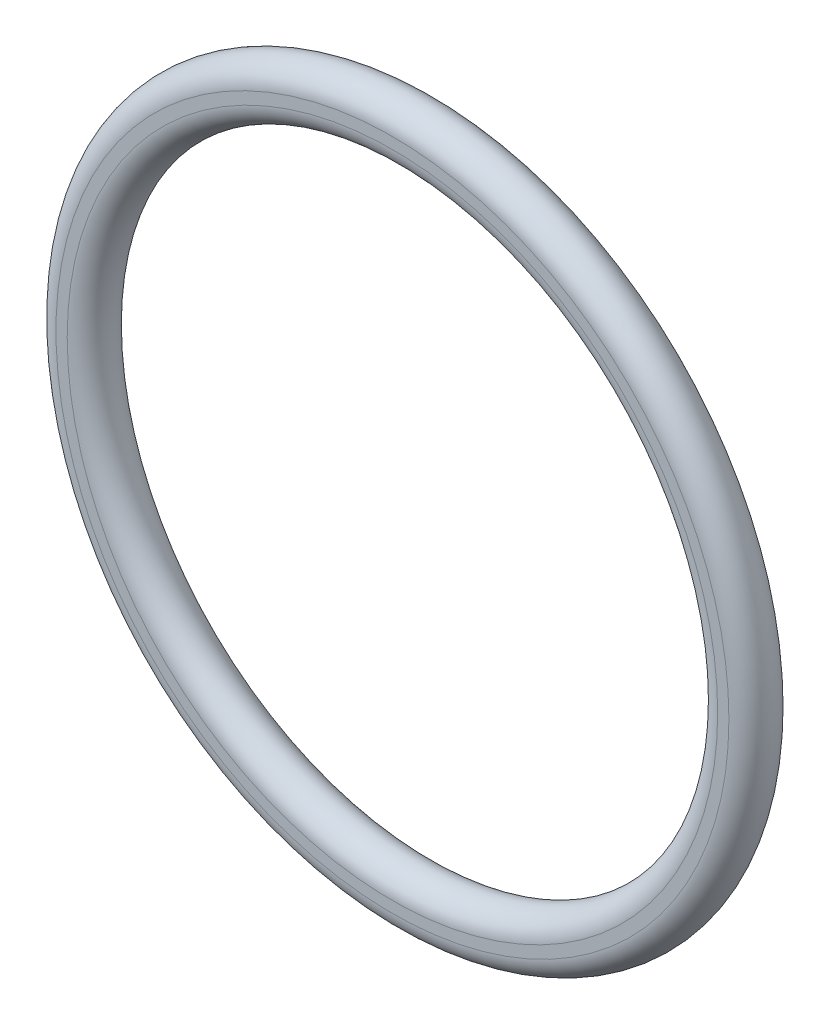
ISO-10303-21;
HEADER;
FILE_DESCRIPTION(('STEP AP214'),'2;1');
FILE_NAME('part.step','',(''),(''),'','','');
FILE_SCHEMA(('AUTOMOTIVE_DESIGN { 1 0 10303 214 1 1 1 1 }'));
ENDSEC;
DATA;
#1=APPLICATION_CONTEXT('core data for automotive mechanical design processes');
#2=APPLICATION_PROTOCOL_DEFINITION('international standard','automotive_design',2000,#1);
#3=PRODUCT_CONTEXT('',#1,'mechanical');
#4=PRODUCT('Part','Part','',(#3));
#5=PRODUCT_RELATED_PRODUCT_CATEGORY('part','',(#4));
#6=PRODUCT_DEFINITION_FORMATION('','',#4);
#7=PRODUCT_DEFINITION_CONTEXT('part definition',#1,'design');
#8=PRODUCT_DEFINITION('design','',#6,#7);
#9=PRODUCT_DEFINITION_SHAPE('','',#8);
#10=(LENGTH_UNIT() NAMED_UNIT(*) SI_UNIT(.MILLI.,.METRE.));
#11=(NAMED_UNIT(*) PLANE_ANGLE_UNIT() SI_UNIT($,.RADIAN.));
#12=(NAMED_UNIT(*) SI_UNIT($,.STERADIAN.) SOLID_ANGLE_UNIT());
#13=UNCERTAINTY_MEASURE_WITH_UNIT(LENGTH_MEASURE(1.E-05),#10,'distance_accuracy_value','');
#14=(GEOMETRIC_REPRESENTATION_CONTEXT(3) GLOBAL_UNCERTAINTY_ASSIGNED_CONTEXT((#13)) GLOBAL_UNIT_ASSIGNED_CONTEXT((#10,
#11,#12)) REPRESENTATION_CONTEXT('',''));
#15=CARTESIAN_POINT('',(0.,0.,0.));
#16=DIRECTION('',(0.,0.,1.));
#17=DIRECTION('',(1.,0.,0.));
#18=AXIS2_PLACEMENT_3D('',#15,#16,#17);
#19=CARTESIAN_POINT('',(0.,0.,0.));
#20=DIRECTION('',(0.,0.,1.));
#21=DIRECTION('',(1.,0.,0.));
#22=AXIS2_PLACEMENT_3D('',#19,#20,#21);
#23=TOROIDAL_SURFACE('',#22,23.01875,1.5875);
#24=CARTESIAN_POINT('',(0.,0.,1.5875));
#25=DIRECTION('',(0.,0.,1.));
#26=DIRECTION('',(1.,0.,0.));
#27=AXIS2_PLACEMENT_3D('',#24,#25,#26);
#28=CIRCLE('',#27,23.01875);
#29=CARTESIAN_POINT('',(23.01875,0.,1.5875));
#30=VERTEX_POINT('',#29);
#31=EDGE_CURVE('E10',#30,#30,#28,.T.);
#32=ORIENTED_EDGE('',*,*,#31,.T.);
#33=EDGE_LOOP('',(#32));
#34=FACE_BOUND('',#33,.T.);
#35=CARTESIAN_POINT('',(0.,0.,-1.5875));
#36=DIRECTION('',(0.,0.,1.));
#37=DIRECTION('',(1.,0.,0.));
#38=AXIS2_PLACEMENT_3D('',#35,#36,#37);
#39=CIRCLE('',#38,23.01875);
#40=CARTESIAN_POINT('',(23.01875,0.,-1.5875));
#41=VERTEX_POINT('',#40);
#42=EDGE_CURVE('E51',#41,#41,#39,.T.);
#43=ORIENTED_EDGE('',*,*,#42,.F.);
#44=EDGE_LOOP('',(#43));
#45=FACE_BOUND('',#44,.T.);
#46=ADVANCED_FACE('F37',(#34,#45),#23,.T.);
#47=CARTESIAN_POINT('',(23.01875,0.,1.5875));
#48=DIRECTION('',(0.,0.,1.));
#49=DIRECTION('',(1.,0.,0.));
#50=AXIS2_PLACEMENT_3D('',#47,#48,#49);
#51=PLANE('',#50);
#52=CARTESIAN_POINT('',(0.,0.,1.5875));
#53=DIRECTION('',(0.,0.,1.));
#54=DIRECTION('',(1.,0.,0.));
#55=AXIS2_PLACEMENT_3D('',#52,#53,#54);
#56=CIRCLE('',#55,23.8125);
#57=CARTESIAN_POINT('',(23.8125,0.,1.5875));
#58=VERTEX_POINT('',#57);
#59=EDGE_CURVE('E43',#58,#58,#56,.T.);
#60=ORIENTED_EDGE('',*,*,#59,.T.);
#61=EDGE_LOOP('',(#60));
#62=FACE_BOUND('',#61,.T.);
#63=ORIENTED_EDGE('',*,*,#31,.F.);
#64=EDGE_LOOP('',(#63));
#65=FACE_BOUND('',#64,.T.);
#66=ADVANCED_FACE('F61',(#62,#65),#51,.T.);
#67=CARTESIAN_POINT('',(0.,0.,0.));
#68=DIRECTION('',(0.,0.,1.));
#69=DIRECTION('',(1.,0.,0.));
#70=AXIS2_PLACEMENT_3D('',#67,#68,#69);
#71=TOROIDAL_SURFACE('',#70,23.8125,1.5875);
#72=CARTESIAN_POINT('',(0.,0.,-1.5875));
#73=DIRECTION('',(0.,0.,1.));
#74=DIRECTION('',(1.,0.,0.));
#75=AXIS2_PLACEMENT_3D('',#72,#73,#74);
#76=CIRCLE('',#75,23.8125);
#77=CARTESIAN_POINT('',(23.8125,0.,-1.5875));
#78=VERTEX_POINT('',#77);
#79=EDGE_CURVE('E47',#78,#78,#76,.T.);
#80=ORIENTED_EDGE('',*,*,#79,.T.);
#81=EDGE_LOOP('',(#80));
#82=FACE_BOUND('',#81,.T.);
#83=ORIENTED_EDGE('',*,*,#59,.F.);
#84=EDGE_LOOP('',(#83));
#85=FACE_BOUND('',#84,.T.);
#86=ADVANCED_FACE('F65',(#82,#85),#71,.T.);
#87=CARTESIAN_POINT('',(23.01875,0.,-1.5875));
#88=DIRECTION('',(0.,0.,-1.));
#89=DIRECTION('',(-1.,0.,0.));
#90=AXIS2_PLACEMENT_3D('',#87,#88,#89);
#91=PLANE('',#90);
#92=ORIENTED_EDGE('',*,*,#42,.T.);
#93=EDGE_LOOP('',(#92));
#94=FACE_BOUND('',#93,.T.);
#95=ORIENTED_EDGE('',*,*,#79,.F.);
#96=EDGE_LOOP('',(#95));
#97=FACE_BOUND('',#96,.T.);
#98=ADVANCED_FACE('F57',(#94,#97),#91,.T.);
#99=CLOSED_SHELL('',(#46,#66,#86,#98));
#100=MANIFOLD_SOLID_BREP('B2',#99);
#101=ADVANCED_BREP_SHAPE_REPRESENTATION('',(#18,#100),#14);
#102=SHAPE_DEFINITION_REPRESENTATION(#9,#101);
ENDSEC;
END-ISO-10303-21;
